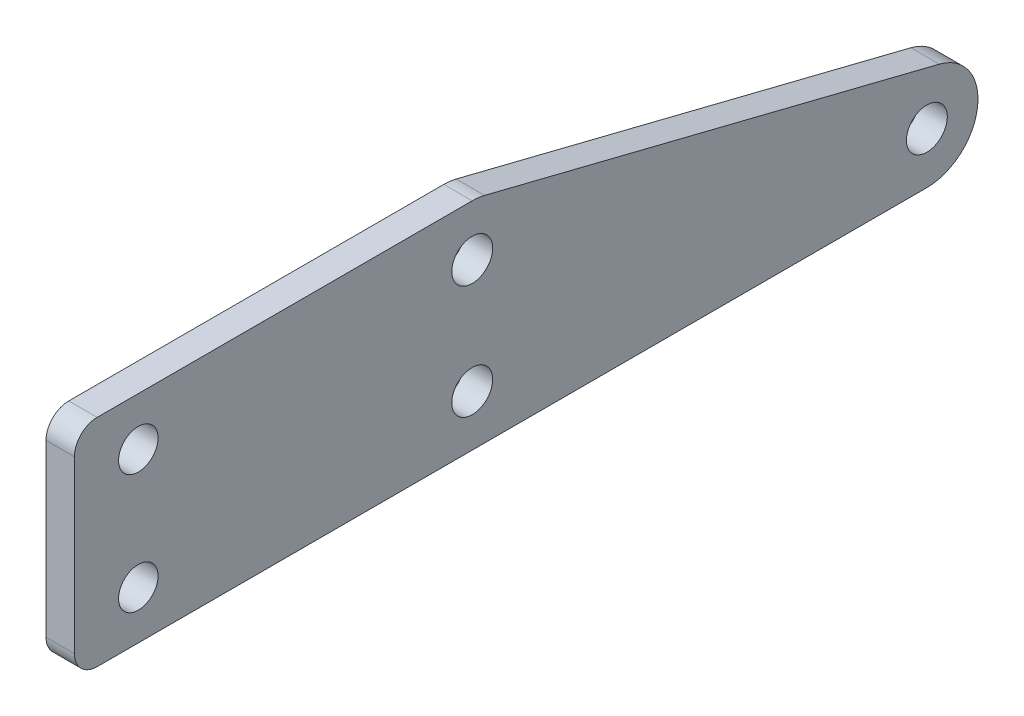
ISO-10303-21;
HEADER;
FILE_DESCRIPTION(('STEP AP214'),'2;1');
FILE_NAME('part.step','',(''),(''),'','','');
FILE_SCHEMA(('AUTOMOTIVE_DESIGN { 1 0 10303 214 1 1 1 1 }'));
ENDSEC;
DATA;
#1=APPLICATION_CONTEXT('core data for automotive mechanical design processes');
#2=APPLICATION_PROTOCOL_DEFINITION('international standard','automotive_design',2000,#1);
#3=PRODUCT_CONTEXT('',#1,'mechanical');
#4=PRODUCT('Part','Part','',(#3));
#5=PRODUCT_RELATED_PRODUCT_CATEGORY('part','',(#4));
#6=PRODUCT_DEFINITION_FORMATION('','',#4);
#7=PRODUCT_DEFINITION_CONTEXT('part definition',#1,'design');
#8=PRODUCT_DEFINITION('design','',#6,#7);
#9=PRODUCT_DEFINITION_SHAPE('','',#8);
#10=(LENGTH_UNIT() NAMED_UNIT(*) SI_UNIT(.MILLI.,.METRE.));
#11=(NAMED_UNIT(*) PLANE_ANGLE_UNIT() SI_UNIT($,.RADIAN.));
#12=(NAMED_UNIT(*) SI_UNIT($,.STERADIAN.) SOLID_ANGLE_UNIT());
#13=UNCERTAINTY_MEASURE_WITH_UNIT(LENGTH_MEASURE(1.E-05),#10,'distance_accuracy_value','');
#14=(GEOMETRIC_REPRESENTATION_CONTEXT(3) GLOBAL_UNCERTAINTY_ASSIGNED_CONTEXT((#13)) GLOBAL_UNIT_ASSIGNED_CONTEXT((#10,
#11,#12)) REPRESENTATION_CONTEXT('',''));
#15=CARTESIAN_POINT('',(0.,0.,0.));
#16=DIRECTION('',(0.,0.,1.));
#17=DIRECTION('',(1.,0.,0.));
#18=AXIS2_PLACEMENT_3D('',#15,#16,#17);
#19=CARTESIAN_POINT('',(3.175,6.35,0.));
#20=DIRECTION('',(1.,0.,0.));
#21=DIRECTION('',(0.,0.,-1.));
#22=AXIS2_PLACEMENT_3D('',#19,#20,#21);
#23=PLANE('',#22);
#24=CARTESIAN_POINT('',(3.175,-6.68008987014344,37.310316922033));
#25=DIRECTION('',(1.,0.,0.));
#26=DIRECTION('',(0.,0.,-1.));
#27=AXIS2_PLACEMENT_3D('',#24,#25,#26);
#28=CIRCLE('',#27,2.20991012985657);
#29=CARTESIAN_POINT('',(3.175,-6.68008987014344,35.1004067921764));
#30=VERTEX_POINT('',#29);
#31=EDGE_CURVE('E203',#30,#30,#28,.T.);
#32=ORIENTED_EDGE('',*,*,#31,.F.);
#33=EDGE_LOOP('',(#32));
#34=FACE_BOUND('',#33,.T.);
#35=CARTESIAN_POINT('',(3.175,6.68008987014344,37.310316922033));
#36=DIRECTION('',(1.,0.,0.));
#37=DIRECTION('',(0.,0.,-1.));
#38=AXIS2_PLACEMENT_3D('',#35,#36,#37);
#39=CIRCLE('',#38,2.20991012985659);
#40=CARTESIAN_POINT('',(3.175,6.68008987014344,35.1004067921764));
#41=VERTEX_POINT('',#40);
#42=EDGE_CURVE('E197',#41,#41,#39,.T.);
#43=ORIENTED_EDGE('',*,*,#42,.F.);
#44=EDGE_LOOP('',(#43));
#45=FACE_BOUND('',#44,.T.);
#46=CARTESIAN_POINT('',(3.175,-6.35,0.));
#47=DIRECTION('',(1.,0.,0.));
#48=DIRECTION('',(0.,0.,-1.));
#49=AXIS2_PLACEMENT_3D('',#46,#47,#48);
#50=CIRCLE('',#49,2.286);
#51=CARTESIAN_POINT('',(3.175,-6.35,-2.286));
#52=VERTEX_POINT('',#51);
#53=EDGE_CURVE('E182',#52,#52,#50,.T.);
#54=ORIENTED_EDGE('',*,*,#53,.F.);
#55=EDGE_LOOP('',(#54));
#56=FACE_BOUND('',#55,.T.);
#57=CARTESIAN_POINT('',(3.175,6.35,0.));
#58=DIRECTION('',(1.,0.,0.));
#59=DIRECTION('',(0.,0.,-1.));
#60=AXIS2_PLACEMENT_3D('',#57,#58,#59);
#61=CIRCLE('',#60,5.715);
#62=CARTESIAN_POINT('',(3.175,11.8943643883306,-1.38609109708264));
#63=VERTEX_POINT('',#62);
#64=CARTESIAN_POINT('',(3.175,12.065,0.));
#65=VERTEX_POINT('',#64);
#66=EDGE_CURVE('E145',#63,#65,#61,.T.);
#67=ORIENTED_EDGE('',*,*,#66,.T.);
#68=DIRECTION('',(0.,0.,1.));
#69=VECTOR('',#68,1.);
#70=CARTESIAN_POINT('',(3.175,12.065,0.));
#71=LINE('',#70,#69);
#72=CARTESIAN_POINT('',(3.175,12.065,41.91));
#73=VERTEX_POINT('',#72);
#74=EDGE_CURVE('E93',#65,#73,#71,.T.);
#75=ORIENTED_EDGE('',*,*,#74,.T.);
#76=CARTESIAN_POINT('',(3.175,9.525,41.91));
#77=DIRECTION('',(1.,0.,0.));
#78=DIRECTION('',(0.,0.,-1.));
#79=AXIS2_PLACEMENT_3D('',#76,#77,#78);
#80=CIRCLE('',#79,2.54);
#81=CARTESIAN_POINT('',(3.175,9.525,44.45));
#82=VERTEX_POINT('',#81);
#83=EDGE_CURVE('E160',#73,#82,#80,.T.);
#84=ORIENTED_EDGE('',*,*,#83,.T.);
#85=DIRECTION('',(0.,-1.,0.));
#86=VECTOR('',#85,1.);
#87=CARTESIAN_POINT('',(3.175,9.525,44.45));
#88=LINE('',#87,#86);
#89=CARTESIAN_POINT('',(3.175,-9.525,44.45));
#90=VERTEX_POINT('',#89);
#91=EDGE_CURVE('E173',#82,#90,#88,.T.);
#92=ORIENTED_EDGE('',*,*,#91,.T.);
#93=CARTESIAN_POINT('',(3.175,-9.525,41.91));
#94=DIRECTION('',(1.,0.,0.));
#95=DIRECTION('',(0.,0.,-1.));
#96=AXIS2_PLACEMENT_3D('',#93,#94,#95);
#97=CIRCLE('',#96,2.54);
#98=CARTESIAN_POINT('',(3.175,-12.065,41.91));
#99=VERTEX_POINT('',#98);
#100=EDGE_CURVE('E112',#90,#99,#97,.T.);
#101=ORIENTED_EDGE('',*,*,#100,.T.);
#102=DIRECTION('',(0.,0.,-1.));
#103=VECTOR('',#102,1.);
#104=CARTESIAN_POINT('',(3.175,-12.065,41.91));
#105=LINE('',#104,#103);
#106=CARTESIAN_POINT('',(3.175,-12.065,-50.8));
#107=VERTEX_POINT('',#106);
#108=EDGE_CURVE('E106',#99,#107,#105,.T.);
#109=ORIENTED_EDGE('',*,*,#108,.T.);
#110=CARTESIAN_POINT('',(3.175,-6.35,-50.8));
#111=DIRECTION('',(1.,0.,0.));
#112=DIRECTION('',(0.,0.,-1.));
#113=AXIS2_PLACEMENT_3D('',#110,#111,#112);
#114=CIRCLE('',#113,5.715);
#115=CARTESIAN_POINT('',(3.175,-0.805635611669429,-52.1860910970826));
#116=VERTEX_POINT('',#115);
#117=EDGE_CURVE('E110',#107,#116,#114,.T.);
#118=ORIENTED_EDGE('',*,*,#117,.T.);
#119=DIRECTION('',(0.,0.242535625036333,0.970142500145332));
#120=VECTOR('',#119,1.);
#121=CARTESIAN_POINT('',(3.175,11.8943643883306,-1.38609109708264));
#122=LINE('',#121,#120);
#123=EDGE_CURVE('E50',#116,#63,#122,.T.);
#124=ORIENTED_EDGE('',*,*,#123,.T.);
#125=EDGE_LOOP('',(#67,#75,#84,#92,#101,#109,#118,#124));
#126=FACE_BOUND('',#125,.T.);
#127=CARTESIAN_POINT('',(3.175,6.35,0.));
#128=DIRECTION('',(1.,0.,0.));
#129=DIRECTION('',(0.,0.,-1.));
#130=AXIS2_PLACEMENT_3D('',#127,#128,#129);
#131=CIRCLE('',#130,2.286);
#132=CARTESIAN_POINT('',(3.175,6.35,-2.286));
#133=VERTEX_POINT('',#132);
#134=EDGE_CURVE('E133',#133,#133,#131,.T.);
#135=ORIENTED_EDGE('',*,*,#134,.F.);
#136=EDGE_LOOP('',(#135));
#137=FACE_BOUND('',#136,.T.);
#138=CARTESIAN_POINT('',(3.175,-6.35,-50.8));
#139=DIRECTION('',(1.,0.,0.));
#140=DIRECTION('',(0.,0.,-1.));
#141=AXIS2_PLACEMENT_3D('',#138,#139,#140);
#142=CIRCLE('',#141,2.28599999999999);
#143=CARTESIAN_POINT('',(3.175,-6.35,-53.086));
#144=VERTEX_POINT('',#143);
#145=EDGE_CURVE('E188',#144,#144,#142,.T.);
#146=ORIENTED_EDGE('',*,*,#145,.F.);
#147=EDGE_LOOP('',(#146));
#148=FACE_BOUND('',#147,.T.);
#149=ADVANCED_FACE('F33',(#34,#45,#56,#126,#137,#148),#23,.T.);
#150=CARTESIAN_POINT('',(0.,6.35,0.));
#151=DIRECTION('',(1.,0.,0.));
#152=DIRECTION('',(0.,0.,-1.));
#153=AXIS2_PLACEMENT_3D('',#150,#151,#152);
#154=PLANE('',#153);
#155=CARTESIAN_POINT('',(0.,-6.68008987014344,37.310316922033));
#156=DIRECTION('',(1.,0.,0.));
#157=DIRECTION('',(0.,0.,-1.));
#158=AXIS2_PLACEMENT_3D('',#155,#156,#157);
#159=CIRCLE('',#158,2.20991012985657);
#160=CARTESIAN_POINT('',(0.,-6.68008987014344,35.1004067921764));
#161=VERTEX_POINT('',#160);
#162=EDGE_CURVE('E200',#161,#161,#159,.T.);
#163=ORIENTED_EDGE('',*,*,#162,.T.);
#164=EDGE_LOOP('',(#163));
#165=FACE_BOUND('',#164,.T.);
#166=CARTESIAN_POINT('',(0.,6.68008987014344,37.310316922033));
#167=DIRECTION('',(1.,0.,0.));
#168=DIRECTION('',(0.,0.,-1.));
#169=AXIS2_PLACEMENT_3D('',#166,#167,#168);
#170=CIRCLE('',#169,2.20991012985659);
#171=CARTESIAN_POINT('',(0.,6.68008987014344,35.1004067921764));
#172=VERTEX_POINT('',#171);
#173=EDGE_CURVE('E194',#172,#172,#170,.T.);
#174=ORIENTED_EDGE('',*,*,#173,.T.);
#175=EDGE_LOOP('',(#174));
#176=FACE_BOUND('',#175,.T.);
#177=CARTESIAN_POINT('',(0.,-6.35,0.));
#178=DIRECTION('',(1.,0.,0.));
#179=DIRECTION('',(0.,0.,-1.));
#180=AXIS2_PLACEMENT_3D('',#177,#178,#179);
#181=CIRCLE('',#180,2.286);
#182=CARTESIAN_POINT('',(0.,-6.35,-2.286));
#183=VERTEX_POINT('',#182);
#184=EDGE_CURVE('E185',#183,#183,#181,.T.);
#185=ORIENTED_EDGE('',*,*,#184,.T.);
#186=EDGE_LOOP('',(#185));
#187=FACE_BOUND('',#186,.T.);
#188=CARTESIAN_POINT('',(0.,6.35,0.));
#189=DIRECTION('',(1.,0.,0.));
#190=DIRECTION('',(0.,0.,-1.));
#191=AXIS2_PLACEMENT_3D('',#188,#189,#190);
#192=CIRCLE('',#191,5.715);
#193=CARTESIAN_POINT('',(0.,11.8943643883306,-1.38609109708264));
#194=VERTEX_POINT('',#193);
#195=CARTESIAN_POINT('',(0.,12.065,0.));
#196=VERTEX_POINT('',#195);
#197=EDGE_CURVE('E129',#194,#196,#192,.T.);
#198=ORIENTED_EDGE('',*,*,#197,.F.);
#199=DIRECTION('',(0.,0.242535625036333,0.970142500145332));
#200=VECTOR('',#199,1.);
#201=CARTESIAN_POINT('',(0.,11.8943643883306,-1.38609109708264));
#202=LINE('',#201,#200);
#203=CARTESIAN_POINT('',(0.,-0.805635611669429,-52.1860910970826));
#204=VERTEX_POINT('',#203);
#205=EDGE_CURVE('E85',#204,#194,#202,.T.);
#206=ORIENTED_EDGE('',*,*,#205,.F.);
#207=CARTESIAN_POINT('',(0.,-6.35,-50.8));
#208=DIRECTION('',(1.,0.,0.));
#209=DIRECTION('',(0.,0.,-1.));
#210=AXIS2_PLACEMENT_3D('',#207,#208,#209);
#211=CIRCLE('',#210,5.715);
#212=CARTESIAN_POINT('',(0.,-12.065,-50.8));
#213=VERTEX_POINT('',#212);
#214=EDGE_CURVE('E79',#213,#204,#211,.T.);
#215=ORIENTED_EDGE('',*,*,#214,.F.);
#216=DIRECTION('',(0.,0.,-1.));
#217=VECTOR('',#216,1.);
#218=CARTESIAN_POINT('',(0.,-12.065,0.));
#219=LINE('',#218,#217);
#220=CARTESIAN_POINT('',(0.,-12.065,41.91));
#221=VERTEX_POINT('',#220);
#222=EDGE_CURVE('E119',#221,#213,#219,.T.);
#223=ORIENTED_EDGE('',*,*,#222,.F.);
#224=CARTESIAN_POINT('',(0.,-9.525,41.91));
#225=DIRECTION('',(1.,0.,0.));
#226=DIRECTION('',(0.,0.,-1.));
#227=AXIS2_PLACEMENT_3D('',#224,#225,#226);
#228=CIRCLE('',#227,2.54);
#229=CARTESIAN_POINT('',(0.,-9.525,44.45));
#230=VERTEX_POINT('',#229);
#231=EDGE_CURVE('E139',#230,#221,#228,.T.);
#232=ORIENTED_EDGE('',*,*,#231,.F.);
#233=DIRECTION('',(0.,-1.,0.));
#234=VECTOR('',#233,1.);
#235=CARTESIAN_POINT('',(0.,9.525,44.45));
#236=LINE('',#235,#234);
#237=CARTESIAN_POINT('',(0.,9.525,44.45));
#238=VERTEX_POINT('',#237);
#239=EDGE_CURVE('E137',#238,#230,#236,.T.);
#240=ORIENTED_EDGE('',*,*,#239,.F.);
#241=CARTESIAN_POINT('',(0.,9.525,41.91));
#242=DIRECTION('',(1.,0.,0.));
#243=DIRECTION('',(0.,0.,-1.));
#244=AXIS2_PLACEMENT_3D('',#241,#242,#243);
#245=CIRCLE('',#244,2.54);
#246=CARTESIAN_POINT('',(0.,12.065,41.91));
#247=VERTEX_POINT('',#246);
#248=EDGE_CURVE('E135',#247,#238,#245,.T.);
#249=ORIENTED_EDGE('',*,*,#248,.F.);
#250=DIRECTION('',(0.,0.,1.));
#251=VECTOR('',#250,1.);
#252=CARTESIAN_POINT('',(0.,12.065,0.));
#253=LINE('',#252,#251);
#254=EDGE_CURVE('E132',#196,#247,#253,.T.);
#255=ORIENTED_EDGE('',*,*,#254,.F.);
#256=EDGE_LOOP('',(#198,#206,#215,#223,#232,#240,#249,#255));
#257=FACE_BOUND('',#256,.T.);
#258=CARTESIAN_POINT('',(0.,6.35,0.));
#259=DIRECTION('',(1.,0.,0.));
#260=DIRECTION('',(0.,0.,-1.));
#261=AXIS2_PLACEMENT_3D('',#258,#259,#260);
#262=CIRCLE('',#261,2.286);
#263=CARTESIAN_POINT('',(0.,6.35,-2.286));
#264=VERTEX_POINT('',#263);
#265=EDGE_CURVE('E179',#264,#264,#262,.T.);
#266=ORIENTED_EDGE('',*,*,#265,.T.);
#267=EDGE_LOOP('',(#266));
#268=FACE_BOUND('',#267,.T.);
#269=CARTESIAN_POINT('',(0.,-6.35,-50.8));
#270=DIRECTION('',(1.,0.,0.));
#271=DIRECTION('',(0.,0.,-1.));
#272=AXIS2_PLACEMENT_3D('',#269,#270,#271);
#273=CIRCLE('',#272,2.28599999999999);
#274=CARTESIAN_POINT('',(0.,-6.35,-53.086));
#275=VERTEX_POINT('',#274);
#276=EDGE_CURVE('E191',#275,#275,#273,.T.);
#277=ORIENTED_EDGE('',*,*,#276,.T.);
#278=EDGE_LOOP('',(#277));
#279=FACE_BOUND('',#278,.T.);
#280=ADVANCED_FACE('F164',(#165,#176,#187,#257,#268,#279),#154,.F.);
#281=CARTESIAN_POINT('',(3.175,6.35,0.));
#282=DIRECTION('',(-1.,0.,0.));
#283=DIRECTION('',(0.,0.,1.));
#284=AXIS2_PLACEMENT_3D('',#281,#282,#283);
#285=CYLINDRICAL_SURFACE('',#284,5.715);
#286=ORIENTED_EDGE('',*,*,#197,.T.);
#287=DIRECTION('',(-1.,0.,0.));
#288=VECTOR('',#287,1.);
#289=CARTESIAN_POINT('',(3.175,12.065,0.));
#290=LINE('',#289,#288);
#291=EDGE_CURVE('E11',#65,#196,#290,.T.);
#292=ORIENTED_EDGE('',*,*,#291,.F.);
#293=ORIENTED_EDGE('',*,*,#66,.F.);
#294=DIRECTION('',(-1.,0.,0.));
#295=VECTOR('',#294,1.);
#296=CARTESIAN_POINT('',(3.175,11.8943643883306,-1.38609109708264));
#297=LINE('',#296,#295);
#298=EDGE_CURVE('E125',#63,#194,#297,.T.);
#299=ORIENTED_EDGE('',*,*,#298,.T.);
#300=EDGE_LOOP('',(#286,#292,#293,#299));
#301=FACE_BOUND('',#300,.T.);
#302=ADVANCED_FACE('F35',(#301),#285,.T.);
#303=CARTESIAN_POINT('',(3.175,12.065,0.));
#304=DIRECTION('',(0.,-1.,0.));
#305=DIRECTION('',(0.,0.,-1.));
#306=AXIS2_PLACEMENT_3D('',#303,#304,#305);
#307=PLANE('',#306);
#308=ORIENTED_EDGE('',*,*,#254,.T.);
#309=DIRECTION('',(-1.,0.,0.));
#310=VECTOR('',#309,1.);
#311=CARTESIAN_POINT('',(3.175,12.065,41.91));
#312=LINE('',#311,#310);
#313=EDGE_CURVE('E42',#73,#247,#312,.T.);
#314=ORIENTED_EDGE('',*,*,#313,.F.);
#315=ORIENTED_EDGE('',*,*,#74,.F.);
#316=ORIENTED_EDGE('',*,*,#291,.T.);
#317=EDGE_LOOP('',(#308,#314,#315,#316));
#318=FACE_BOUND('',#317,.T.);
#319=ADVANCED_FACE('F238',(#318),#307,.F.);
#320=CARTESIAN_POINT('',(3.175,9.525,41.91));
#321=DIRECTION('',(-1.,0.,0.));
#322=DIRECTION('',(0.,0.,1.));
#323=AXIS2_PLACEMENT_3D('',#320,#321,#322);
#324=CYLINDRICAL_SURFACE('',#323,2.54);
#325=ORIENTED_EDGE('',*,*,#248,.T.);
#326=DIRECTION('',(-1.,0.,0.));
#327=VECTOR('',#326,1.);
#328=CARTESIAN_POINT('',(3.175,9.525,44.45));
#329=LINE('',#328,#327);
#330=EDGE_CURVE('E152',#82,#238,#329,.T.);
#331=ORIENTED_EDGE('',*,*,#330,.F.);
#332=ORIENTED_EDGE('',*,*,#83,.F.);
#333=ORIENTED_EDGE('',*,*,#313,.T.);
#334=EDGE_LOOP('',(#325,#331,#332,#333));
#335=FACE_BOUND('',#334,.T.);
#336=ADVANCED_FACE('F158',(#335),#324,.T.);
#337=CARTESIAN_POINT('',(3.175,9.525,44.45));
#338=DIRECTION('',(0.,0.,-1.));
#339=DIRECTION('',(-1.,0.,0.));
#340=AXIS2_PLACEMENT_3D('',#337,#338,#339);
#341=PLANE('',#340);
#342=ORIENTED_EDGE('',*,*,#239,.T.);
#343=DIRECTION('',(-1.,0.,0.));
#344=VECTOR('',#343,1.);
#345=CARTESIAN_POINT('',(3.175,-9.525,44.45));
#346=LINE('',#345,#344);
#347=EDGE_CURVE('E149',#90,#230,#346,.T.);
#348=ORIENTED_EDGE('',*,*,#347,.F.);
#349=ORIENTED_EDGE('',*,*,#91,.F.);
#350=ORIENTED_EDGE('',*,*,#330,.T.);
#351=EDGE_LOOP('',(#342,#348,#349,#350));
#352=FACE_BOUND('',#351,.T.);
#353=ADVANCED_FACE('F169',(#352),#341,.F.);
#354=CARTESIAN_POINT('',(3.175,-9.525,41.91));
#355=DIRECTION('',(-1.,0.,0.));
#356=DIRECTION('',(0.,0.,1.));
#357=AXIS2_PLACEMENT_3D('',#354,#355,#356);
#358=CYLINDRICAL_SURFACE('',#357,2.54);
#359=ORIENTED_EDGE('',*,*,#231,.T.);
#360=DIRECTION('',(-1.,0.,0.));
#361=VECTOR('',#360,1.);
#362=CARTESIAN_POINT('',(3.175,-12.065,41.91));
#363=LINE('',#362,#361);
#364=EDGE_CURVE('E120',#99,#221,#363,.T.);
#365=ORIENTED_EDGE('',*,*,#364,.F.);
#366=ORIENTED_EDGE('',*,*,#100,.F.);
#367=ORIENTED_EDGE('',*,*,#347,.T.);
#368=EDGE_LOOP('',(#359,#365,#366,#367));
#369=FACE_BOUND('',#368,.T.);
#370=ADVANCED_FACE('F172',(#369),#358,.T.);
#371=CARTESIAN_POINT('',(3.175,-12.065,0.));
#372=DIRECTION('',(0.,1.,0.));
#373=DIRECTION('',(0.,0.,1.));
#374=AXIS2_PLACEMENT_3D('',#371,#372,#373);
#375=PLANE('',#374);
#376=ORIENTED_EDGE('',*,*,#222,.T.);
#377=DIRECTION('',(-1.,0.,0.));
#378=VECTOR('',#377,1.);
#379=CARTESIAN_POINT('',(3.175,-12.065,-50.8));
#380=LINE('',#379,#378);
#381=EDGE_CURVE('E117',#107,#213,#380,.T.);
#382=ORIENTED_EDGE('',*,*,#381,.F.);
#383=ORIENTED_EDGE('',*,*,#108,.F.);
#384=ORIENTED_EDGE('',*,*,#364,.T.);
#385=EDGE_LOOP('',(#376,#382,#383,#384));
#386=FACE_BOUND('',#385,.T.);
#387=ADVANCED_FACE('F118',(#386),#375,.F.);
#388=CARTESIAN_POINT('',(3.175,-6.35,-50.8));
#389=DIRECTION('',(-1.,0.,0.));
#390=DIRECTION('',(0.,0.,1.));
#391=AXIS2_PLACEMENT_3D('',#388,#389,#390);
#392=CYLINDRICAL_SURFACE('',#391,5.715);
#393=ORIENTED_EDGE('',*,*,#214,.T.);
#394=DIRECTION('',(-1.,0.,0.));
#395=VECTOR('',#394,1.);
#396=CARTESIAN_POINT('',(3.175,-0.805635611669429,-52.1860910970826));
#397=LINE('',#396,#395);
#398=EDGE_CURVE('E121',#116,#204,#397,.T.);
#399=ORIENTED_EDGE('',*,*,#398,.F.);
#400=ORIENTED_EDGE('',*,*,#117,.F.);
#401=ORIENTED_EDGE('',*,*,#381,.T.);
#402=EDGE_LOOP('',(#393,#399,#400,#401));
#403=FACE_BOUND('',#402,.T.);
#404=ADVANCED_FACE('F123',(#403),#392,.T.);
#405=CARTESIAN_POINT('',(3.175,11.8943643883306,-1.38609109708264));
#406=DIRECTION('',(0.,-0.970142500145332,0.242535625036333));
#407=DIRECTION('',(0.,-0.242535625036333,-0.970142500145332));
#408=AXIS2_PLACEMENT_3D('',#405,#406,#407);
#409=PLANE('',#408);
#410=ORIENTED_EDGE('',*,*,#205,.T.);
#411=ORIENTED_EDGE('',*,*,#298,.F.);
#412=ORIENTED_EDGE('',*,*,#123,.F.);
#413=ORIENTED_EDGE('',*,*,#398,.T.);
#414=EDGE_LOOP('',(#410,#411,#412,#413));
#415=FACE_BOUND('',#414,.T.);
#416=ADVANCED_FACE('F242',(#415),#409,.F.);
#417=CARTESIAN_POINT('',(3.175,6.35,0.));
#418=DIRECTION('',(-1.,0.,0.));
#419=DIRECTION('',(0.,0.,1.));
#420=AXIS2_PLACEMENT_3D('',#417,#418,#419);
#421=CYLINDRICAL_SURFACE('',#420,2.286);
#422=ORIENTED_EDGE('',*,*,#134,.T.);
#423=EDGE_LOOP('',(#422));
#424=FACE_BOUND('',#423,.T.);
#425=ORIENTED_EDGE('',*,*,#265,.F.);
#426=EDGE_LOOP('',(#425));
#427=FACE_BOUND('',#426,.T.);
#428=ADVANCED_FACE('F229',(#424,#427),#421,.F.);
#429=CARTESIAN_POINT('',(3.175,-6.35,0.));
#430=DIRECTION('',(-1.,0.,0.));
#431=DIRECTION('',(0.,0.,1.));
#432=AXIS2_PLACEMENT_3D('',#429,#430,#431);
#433=CYLINDRICAL_SURFACE('',#432,2.286);
#434=ORIENTED_EDGE('',*,*,#53,.T.);
#435=EDGE_LOOP('',(#434));
#436=FACE_BOUND('',#435,.T.);
#437=ORIENTED_EDGE('',*,*,#184,.F.);
#438=EDGE_LOOP('',(#437));
#439=FACE_BOUND('',#438,.T.);
#440=ADVANCED_FACE('F225',(#436,#439),#433,.F.);
#441=CARTESIAN_POINT('',(3.175,-6.35,-50.8));
#442=DIRECTION('',(-1.,0.,0.));
#443=DIRECTION('',(0.,0.,1.));
#444=AXIS2_PLACEMENT_3D('',#441,#442,#443);
#445=CYLINDRICAL_SURFACE('',#444,2.28599999999999);
#446=ORIENTED_EDGE('',*,*,#145,.T.);
#447=EDGE_LOOP('',(#446));
#448=FACE_BOUND('',#447,.T.);
#449=ORIENTED_EDGE('',*,*,#276,.F.);
#450=EDGE_LOOP('',(#449));
#451=FACE_BOUND('',#450,.T.);
#452=ADVANCED_FACE('F228',(#448,#451),#445,.F.);
#453=CARTESIAN_POINT('',(0.,6.68008987014344,37.310316922033));
#454=DIRECTION('',(1.,0.,0.));
#455=DIRECTION('',(0.,0.,-1.));
#456=AXIS2_PLACEMENT_3D('',#453,#454,#455);
#457=CYLINDRICAL_SURFACE('',#456,2.20991012985659);
#458=ORIENTED_EDGE('',*,*,#173,.F.);
#459=EDGE_LOOP('',(#458));
#460=FACE_BOUND('',#459,.T.);
#461=ORIENTED_EDGE('',*,*,#42,.T.);
#462=EDGE_LOOP('',(#461));
#463=FACE_BOUND('',#462,.T.);
#464=ADVANCED_FACE('F214',(#460,#463),#457,.F.);
#465=CARTESIAN_POINT('',(0.,-6.68008987014344,37.310316922033));
#466=DIRECTION('',(1.,0.,0.));
#467=DIRECTION('',(0.,0.,-1.));
#468=AXIS2_PLACEMENT_3D('',#465,#466,#467);
#469=CYLINDRICAL_SURFACE('',#468,2.20991012985657);
#470=ORIENTED_EDGE('',*,*,#162,.F.);
#471=EDGE_LOOP('',(#470));
#472=FACE_BOUND('',#471,.T.);
#473=ORIENTED_EDGE('',*,*,#31,.T.);
#474=EDGE_LOOP('',(#473));
#475=FACE_BOUND('',#474,.T.);
#476=ADVANCED_FACE('F211',(#472,#475),#469,.F.);
#477=CLOSED_SHELL('',(#149,#280,#302,#319,#336,#353,#370,#387,#404,#416,#428,#440,#452,#464,#476));
#478=MANIFOLD_SOLID_BREP('B2',#477);
#479=ADVANCED_BREP_SHAPE_REPRESENTATION('',(#18,#478),#14);
#480=SHAPE_DEFINITION_REPRESENTATION(#9,#479);
ENDSEC;
END-ISO-10303-21;
